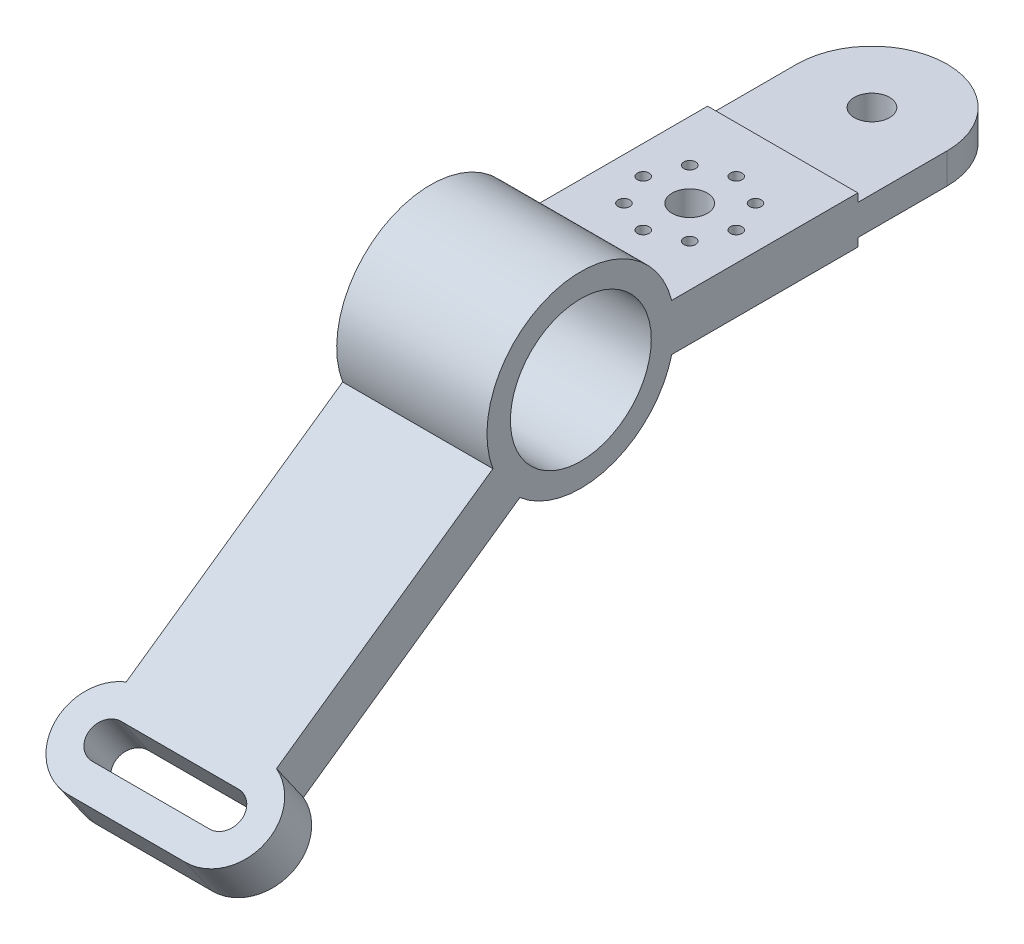
ISO-10303-21;
HEADER;
FILE_DESCRIPTION(('STEP AP214'),'2;1');
FILE_NAME('part.step','',(''),(''),'','','');
FILE_SCHEMA(('AUTOMOTIVE_DESIGN { 1 0 10303 214 1 1 1 1 }'));
ENDSEC;
DATA;
#1=APPLICATION_CONTEXT('core data for automotive mechanical design processes');
#2=APPLICATION_PROTOCOL_DEFINITION('international standard','automotive_design',2000,#1);
#3=PRODUCT_CONTEXT('',#1,'mechanical');
#4=PRODUCT('Part','Part','',(#3));
#5=PRODUCT_RELATED_PRODUCT_CATEGORY('part','',(#4));
#6=PRODUCT_DEFINITION_FORMATION('','',#4);
#7=PRODUCT_DEFINITION_CONTEXT('part definition',#1,'design');
#8=PRODUCT_DEFINITION('design','',#6,#7);
#9=PRODUCT_DEFINITION_SHAPE('','',#8);
#10=(LENGTH_UNIT() NAMED_UNIT(*) SI_UNIT(.MILLI.,.METRE.));
#11=(NAMED_UNIT(*) PLANE_ANGLE_UNIT() SI_UNIT($,.RADIAN.));
#12=(NAMED_UNIT(*) SI_UNIT($,.STERADIAN.) SOLID_ANGLE_UNIT());
#13=UNCERTAINTY_MEASURE_WITH_UNIT(LENGTH_MEASURE(1.E-05),#10,'distance_accuracy_value','');
#14=(GEOMETRIC_REPRESENTATION_CONTEXT(3) GLOBAL_UNCERTAINTY_ASSIGNED_CONTEXT((#13)) GLOBAL_UNIT_ASSIGNED_CONTEXT((#10,
#11,#12)) REPRESENTATION_CONTEXT('',''));
#15=CARTESIAN_POINT('',(0.,0.,0.));
#16=DIRECTION('',(0.,0.,1.));
#17=DIRECTION('',(1.,0.,0.));
#18=AXIS2_PLACEMENT_3D('',#15,#16,#17);
#19=CARTESIAN_POINT('',(32.,89.3164737367872,-144.991611892639));
#20=DIRECTION('',(1.,0.,0.));
#21=DIRECTION('',(0.,0.,-1.));
#22=AXIS2_PLACEMENT_3D('',#19,#20,#21);
#23=PLANE('',#22);
#24=DIRECTION('',(0.,0.819152044288995,0.573576436351042));
#25=VECTOR('',#24,1.);
#26=CARTESIAN_POINT('',(32.,-41.6797797436734,-52.0557005573729));
#27=LINE('',#26,#25);
#28=CARTESIAN_POINT('',(32.,-5.63708979495766,-26.818337357927));
#29=VERTEX_POINT('',#28);
#30=CARTESIAN_POINT('',(32.,10.7459510908222,-15.3468086309062));
#31=VERTEX_POINT('',#30);
#32=EDGE_CURVE('E260',#29,#31,#27,.T.);
#33=ORIENTED_EDGE('',*,*,#32,.F.);
#34=DIRECTION('',(0.,0.573576436351042,-0.819152044288995));
#35=VECTOR('',#34,1.);
#36=CARTESIAN_POINT('',(32.,-16.3830408857799,-11.4715287270208));
#37=LINE('',#36,#35);
#38=CARTESIAN_POINT('',(32.,58.9104334362514,-119.00175400072));
#39=VERTEX_POINT('',#38);
#40=EDGE_CURVE('E110',#29,#39,#37,.T.);
#41=ORIENTED_EDGE('',*,*,#40,.T.);
#42=CARTESIAN_POINT('',(32.,89.3164737367872,-144.991611892639));
#43=DIRECTION('',(1.,0.,0.));
#44=DIRECTION('',(0.,0.,-1.));
#45=AXIS2_PLACEMENT_3D('',#42,#43,#44);
#46=CIRCLE('',#45,40.);
#47=CARTESIAN_POINT('',(32.,79.3164737367872,-183.721445354714));
#48=VERTEX_POINT('',#47);
#49=EDGE_CURVE('E249',#39,#48,#46,.T.);
#50=ORIENTED_EDGE('',*,*,#49,.T.);
#51=DIRECTION('',(0.,0.,-1.));
#52=VECTOR('',#51,1.);
#53=CARTESIAN_POINT('',(32.,79.3164737367872,-262.99161189264));
#54=LINE('',#53,#52);
#55=CARTESIAN_POINT('',(32.,79.3164737367872,-262.99161189264));
#56=VERTEX_POINT('',#55);
#57=EDGE_CURVE('E211',#48,#56,#54,.T.);
#58=ORIENTED_EDGE('',*,*,#57,.T.);
#59=DIRECTION('',(0.,1.,0.));
#60=VECTOR('',#59,1.);
#61=CARTESIAN_POINT('',(32.,82.8164737367872,-262.99161189264));
#62=LINE('',#61,#60);
#63=CARTESIAN_POINT('',(32.,82.8164737367872,-262.99161189264));
#64=VERTEX_POINT('',#63);
#65=EDGE_CURVE('E239',#56,#64,#62,.T.);
#66=ORIENTED_EDGE('',*,*,#65,.T.);
#67=DIRECTION('',(0.,0.,-1.));
#68=VECTOR('',#67,1.);
#69=CARTESIAN_POINT('',(32.,82.8164737367872,-300.99161189264));
#70=LINE('',#69,#68);
#71=CARTESIAN_POINT('',(32.,82.8164737367872,-300.99161189264));
#72=VERTEX_POINT('',#71);
#73=EDGE_CURVE('E232',#64,#72,#70,.T.);
#74=ORIENTED_EDGE('',*,*,#73,.T.);
#75=DIRECTION('',(0.,1.,0.));
#76=VECTOR('',#75,1.);
#77=CARTESIAN_POINT('',(32.,95.8164737367872,-300.99161189264));
#78=LINE('',#77,#76);
#79=CARTESIAN_POINT('',(32.,95.8164737367872,-300.99161189264));
#80=VERTEX_POINT('',#79);
#81=EDGE_CURVE('E238',#72,#80,#78,.T.);
#82=ORIENTED_EDGE('',*,*,#81,.T.);
#83=DIRECTION('',(0.,0.,1.));
#84=VECTOR('',#83,1.);
#85=CARTESIAN_POINT('',(32.,95.8164737367872,-262.99161189264));
#86=LINE('',#85,#84);
#87=CARTESIAN_POINT('',(32.,95.8164737367872,-262.99161189264));
#88=VERTEX_POINT('',#87);
#89=EDGE_CURVE('E133',#80,#88,#86,.T.);
#90=ORIENTED_EDGE('',*,*,#89,.T.);
#91=DIRECTION('',(0.,1.,0.));
#92=VECTOR('',#91,1.);
#93=CARTESIAN_POINT('',(32.,99.3164737367872,-262.99161189264));
#94=LINE('',#93,#92);
#95=CARTESIAN_POINT('',(32.,99.3164737367872,-262.99161189264));
#96=VERTEX_POINT('',#95);
#97=EDGE_CURVE('E126',#88,#96,#94,.T.);
#98=ORIENTED_EDGE('',*,*,#97,.T.);
#99=DIRECTION('',(0.,0.,1.));
#100=VECTOR('',#99,1.);
#101=CARTESIAN_POINT('',(32.,99.3164737367872,-262.99161189264));
#102=LINE('',#101,#100);
#103=CARTESIAN_POINT('',(32.,99.3164737367872,-183.721445354714));
#104=VERTEX_POINT('',#103);
#105=EDGE_CURVE('E130',#96,#104,#102,.T.);
#106=ORIENTED_EDGE('',*,*,#105,.T.);
#107=CARTESIAN_POINT('',(32.,89.3164737367872,-144.991611892639));
#108=DIRECTION('',(1.,0.,0.));
#109=DIRECTION('',(0.,0.,-1.));
#110=AXIS2_PLACEMENT_3D('',#107,#108,#109);
#111=CIRCLE('',#110,40.);
#112=CARTESIAN_POINT('',(32.,75.2934743220313,-107.530225273699));
#113=VERTEX_POINT('',#112);
#114=EDGE_CURVE('E63',#104,#113,#111,.T.);
#115=ORIENTED_EDGE('',*,*,#114,.T.);
#116=DIRECTION('',(0.,-0.573576436351042,0.819152044288995));
#117=VECTOR('',#116,1.);
#118=CARTESIAN_POINT('',(32.,0.,0.));
#119=LINE('',#118,#117);
#120=EDGE_CURVE('E189',#113,#31,#119,.T.);
#121=ORIENTED_EDGE('',*,*,#120,.T.);
#122=EDGE_LOOP('',(#33,#41,#50,#58,#66,#74,#82,#90,#98,#106,#115,#121));
#123=FACE_BOUND('',#122,.T.);
#124=CARTESIAN_POINT('',(32.,89.3164737367872,-144.991611892639));
#125=DIRECTION('',(1.,0.,0.));
#126=DIRECTION('',(0.,0.,-1.));
#127=AXIS2_PLACEMENT_3D('',#124,#125,#126);
#128=CIRCLE('',#127,30.);
#129=CARTESIAN_POINT('',(32.,89.3164737367872,-174.991611892639));
#130=VERTEX_POINT('',#129);
#131=EDGE_CURVE('E160',#130,#130,#128,.T.);
#132=ORIENTED_EDGE('',*,*,#131,.F.);
#133=EDGE_LOOP('',(#132));
#134=FACE_BOUND('',#133,.T.);
#135=ADVANCED_FACE('F45',(#123,#134),#23,.T.);
#136=CARTESIAN_POINT('',(-32.,89.3164737367872,-144.991611892639));
#137=DIRECTION('',(1.,0.,0.));
#138=DIRECTION('',(0.,0.,-1.));
#139=AXIS2_PLACEMENT_3D('',#136,#137,#138);
#140=PLANE('',#139);
#141=DIRECTION('',(0.,0.573576436351042,-0.819152044288995));
#142=VECTOR('',#141,1.);
#143=CARTESIAN_POINT('',(-32.,-16.3830408857799,-11.4715287270208));
#144=LINE('',#143,#142);
#145=CARTESIAN_POINT('',(-32.,-5.63708979495766,-26.818337357927));
#146=VERTEX_POINT('',#145);
#147=CARTESIAN_POINT('',(-32.,58.9104334362514,-119.00175400072));
#148=VERTEX_POINT('',#147);
#149=EDGE_CURVE('E159',#146,#148,#144,.T.);
#150=ORIENTED_EDGE('',*,*,#149,.F.);
#151=DIRECTION('',(0.,0.819152044288995,0.573576436351042));
#152=VECTOR('',#151,1.);
#153=CARTESIAN_POINT('',(-32.,-41.6797797436734,-52.0557005573729));
#154=LINE('',#153,#152);
#155=CARTESIAN_POINT('',(-32.,10.7459510908222,-15.3468086309062));
#156=VERTEX_POINT('',#155);
#157=EDGE_CURVE('E267',#146,#156,#154,.T.);
#158=ORIENTED_EDGE('',*,*,#157,.T.);
#159=DIRECTION('',(0.,-0.573576436351042,0.819152044288995));
#160=VECTOR('',#159,1.);
#161=CARTESIAN_POINT('',(-32.,0.,0.));
#162=LINE('',#161,#160);
#163=CARTESIAN_POINT('',(-32.,75.2934743220313,-107.530225273699));
#164=VERTEX_POINT('',#163);
#165=EDGE_CURVE('E155',#164,#156,#162,.T.);
#166=ORIENTED_EDGE('',*,*,#165,.F.);
#167=CARTESIAN_POINT('',(-32.,89.3164737367872,-144.991611892639));
#168=DIRECTION('',(1.,0.,0.));
#169=DIRECTION('',(0.,0.,-1.));
#170=AXIS2_PLACEMENT_3D('',#167,#168,#169);
#171=CIRCLE('',#170,40.);
#172=CARTESIAN_POINT('',(-32.,99.3164737367872,-183.721445354714));
#173=VERTEX_POINT('',#172);
#174=EDGE_CURVE('E102',#173,#164,#171,.T.);
#175=ORIENTED_EDGE('',*,*,#174,.F.);
#176=DIRECTION('',(0.,0.,1.));
#177=VECTOR('',#176,1.);
#178=CARTESIAN_POINT('',(-32.,99.3164737367872,-262.99161189264));
#179=LINE('',#178,#177);
#180=CARTESIAN_POINT('',(-32.,99.3164737367872,-262.99161189264));
#181=VERTEX_POINT('',#180);
#182=EDGE_CURVE('E96',#181,#173,#179,.T.);
#183=ORIENTED_EDGE('',*,*,#182,.F.);
#184=DIRECTION('',(0.,1.,0.));
#185=VECTOR('',#184,1.);
#186=CARTESIAN_POINT('',(-32.,99.3164737367872,-262.99161189264));
#187=LINE('',#186,#185);
#188=CARTESIAN_POINT('',(-32.,95.8164737367872,-262.99161189264));
#189=VERTEX_POINT('',#188);
#190=EDGE_CURVE('E142',#189,#181,#187,.T.);
#191=ORIENTED_EDGE('',*,*,#190,.F.);
#192=DIRECTION('',(0.,0.,1.));
#193=VECTOR('',#192,1.);
#194=CARTESIAN_POINT('',(-32.,95.8164737367872,-262.99161189264));
#195=LINE('',#194,#193);
#196=CARTESIAN_POINT('',(-32.,95.8164737367872,-300.99161189264));
#197=VERTEX_POINT('',#196);
#198=EDGE_CURVE('E180',#197,#189,#195,.T.);
#199=ORIENTED_EDGE('',*,*,#198,.F.);
#200=DIRECTION('',(0.,1.,0.));
#201=VECTOR('',#200,1.);
#202=CARTESIAN_POINT('',(-32.,95.8164737367872,-300.99161189264));
#203=LINE('',#202,#201);
#204=CARTESIAN_POINT('',(-32.,82.8164737367872,-300.99161189264));
#205=VERTEX_POINT('',#204);
#206=EDGE_CURVE('E176',#205,#197,#203,.T.);
#207=ORIENTED_EDGE('',*,*,#206,.F.);
#208=DIRECTION('',(0.,0.,-1.));
#209=VECTOR('',#208,1.);
#210=CARTESIAN_POINT('',(-32.,82.8164737367872,-300.99161189264));
#211=LINE('',#210,#209);
#212=CARTESIAN_POINT('',(-32.,82.8164737367872,-262.99161189264));
#213=VERTEX_POINT('',#212);
#214=EDGE_CURVE('E172',#213,#205,#211,.T.);
#215=ORIENTED_EDGE('',*,*,#214,.F.);
#216=DIRECTION('',(0.,1.,0.));
#217=VECTOR('',#216,1.);
#218=CARTESIAN_POINT('',(-32.,82.8164737367872,-262.99161189264));
#219=LINE('',#218,#217);
#220=CARTESIAN_POINT('',(-32.,79.3164737367872,-262.99161189264));
#221=VERTEX_POINT('',#220);
#222=EDGE_CURVE('E169',#221,#213,#219,.T.);
#223=ORIENTED_EDGE('',*,*,#222,.F.);
#224=DIRECTION('',(0.,0.,-1.));
#225=VECTOR('',#224,1.);
#226=CARTESIAN_POINT('',(-32.,79.3164737367872,-262.99161189264));
#227=LINE('',#226,#225);
#228=CARTESIAN_POINT('',(-32.,79.3164737367872,-183.721445354714));
#229=VERTEX_POINT('',#228);
#230=EDGE_CURVE('E166',#229,#221,#227,.T.);
#231=ORIENTED_EDGE('',*,*,#230,.F.);
#232=CARTESIAN_POINT('',(-32.,89.3164737367872,-144.991611892639));
#233=DIRECTION('',(1.,0.,0.));
#234=DIRECTION('',(0.,0.,-1.));
#235=AXIS2_PLACEMENT_3D('',#232,#233,#234);
#236=CIRCLE('',#235,40.);
#237=EDGE_CURVE('E163',#148,#229,#236,.T.);
#238=ORIENTED_EDGE('',*,*,#237,.F.);
#239=EDGE_LOOP('',(#150,#158,#166,#175,#183,#191,#199,#207,#215,#223,#231,#238));
#240=FACE_BOUND('',#239,.T.);
#241=CARTESIAN_POINT('',(-32.,89.3164737367872,-144.991611892639));
#242=DIRECTION('',(1.,0.,0.));
#243=DIRECTION('',(0.,0.,-1.));
#244=AXIS2_PLACEMENT_3D('',#241,#242,#243);
#245=CIRCLE('',#244,30.);
#246=CARTESIAN_POINT('',(-32.,89.3164737367872,-174.991611892639));
#247=VERTEX_POINT('',#246);
#248=EDGE_CURVE('E256',#247,#247,#245,.T.);
#249=ORIENTED_EDGE('',*,*,#248,.T.);
#250=EDGE_LOOP('',(#249));
#251=FACE_BOUND('',#250,.T.);
#252=ADVANCED_FACE('F218',(#240,#251),#140,.F.);
#253=CARTESIAN_POINT('',(32.,0.,0.));
#254=DIRECTION('',(0.,-0.819152044288995,-0.573576436351042));
#255=DIRECTION('',(0.,0.573576436351042,-0.819152044288995));
#256=AXIS2_PLACEMENT_3D('',#253,#254,#255);
#257=PLANE('',#256);
#258=ORIENTED_EDGE('',*,*,#165,.T.);
#259=CARTESIAN_POINT('',(-25.,0.,0.));
#260=DIRECTION('',(0.,0.819152044288995,0.573576436351042));
#261=DIRECTION('',(0.,-0.573576436351042,0.819152044288995));
#262=AXIS2_PLACEMENT_3D('',#259,#260,#261);
#263=CIRCLE('',#262,20.);
#264=CARTESIAN_POINT('',(-25.,-11.4715287270208,16.3830408857799));
#265=VERTEX_POINT('',#264);
#266=EDGE_CURVE('E289',#156,#265,#263,.T.);
#267=ORIENTED_EDGE('',*,*,#266,.T.);
#268=DIRECTION('',(1.,0.,0.));
#269=VECTOR('',#268,1.);
#270=CARTESIAN_POINT('',(25.,-11.4715287270208,16.3830408857799));
#271=LINE('',#270,#269);
#272=CARTESIAN_POINT('',(25.,-11.4715287270208,16.3830408857799));
#273=VERTEX_POINT('',#272);
#274=EDGE_CURVE('E282',#265,#273,#271,.T.);
#275=ORIENTED_EDGE('',*,*,#274,.T.);
#276=CARTESIAN_POINT('',(25.,0.,0.));
#277=DIRECTION('',(0.,0.819152044288995,0.573576436351042));
#278=DIRECTION('',(0.,-0.573576436351042,0.819152044288995));
#279=AXIS2_PLACEMENT_3D('',#276,#277,#278);
#280=CIRCLE('',#279,20.);
#281=EDGE_CURVE('E293',#273,#31,#280,.T.);
#282=ORIENTED_EDGE('',*,*,#281,.T.);
#283=ORIENTED_EDGE('',*,*,#120,.F.);
#284=DIRECTION('',(-1.,0.,0.));
#285=VECTOR('',#284,1.);
#286=CARTESIAN_POINT('',(32.,75.2934743220313,-107.530225273699));
#287=LINE('',#286,#285);
#288=EDGE_CURVE('E151',#113,#164,#287,.T.);
#289=ORIENTED_EDGE('',*,*,#288,.T.);
#290=EDGE_LOOP('',(#258,#267,#275,#282,#283,#289));
#291=FACE_BOUND('',#290,.T.);
#292=CARTESIAN_POINT('',(25.,0.,0.));
#293=DIRECTION('',(0.,0.819152044288995,0.573576436351042));
#294=DIRECTION('',(0.,-0.573576436351042,0.819152044288995));
#295=AXIS2_PLACEMENT_3D('',#292,#293,#294);
#296=CIRCLE('',#295,7.5);
#297=CARTESIAN_POINT('',(25.,-4.30182327263282,6.14364033216747));
#298=VERTEX_POINT('',#297);
#299=CARTESIAN_POINT('',(25.,4.30182327263281,-6.14364033216746));
#300=VERTEX_POINT('',#299);
#301=EDGE_CURVE('E325',#298,#300,#296,.T.);
#302=ORIENTED_EDGE('',*,*,#301,.F.);
#303=DIRECTION('',(1.,0.,0.));
#304=VECTOR('',#303,1.);
#305=CARTESIAN_POINT('',(25.,-4.30182327263282,6.14364033216747));
#306=LINE('',#305,#304);
#307=CARTESIAN_POINT('',(-25.,-4.30182327263282,6.14364033216747));
#308=VERTEX_POINT('',#307);
#309=EDGE_CURVE('E303',#308,#298,#306,.T.);
#310=ORIENTED_EDGE('',*,*,#309,.F.);
#311=CARTESIAN_POINT('',(-25.,0.,0.));
#312=DIRECTION('',(0.,0.819152044288995,0.573576436351042));
#313=DIRECTION('',(0.,-0.573576436351042,0.819152044288995));
#314=AXIS2_PLACEMENT_3D('',#311,#312,#313);
#315=CIRCLE('',#314,7.5);
#316=CARTESIAN_POINT('',(-25.,4.30182327263281,-6.14364033216745));
#317=VERTEX_POINT('',#316);
#318=EDGE_CURVE('E317',#317,#308,#315,.T.);
#319=ORIENTED_EDGE('',*,*,#318,.F.);
#320=DIRECTION('',(-1.,0.,0.));
#321=VECTOR('',#320,1.);
#322=CARTESIAN_POINT('',(25.,4.30182327263281,-6.14364033216746));
#323=LINE('',#322,#321);
#324=EDGE_CURVE('E321',#300,#317,#323,.T.);
#325=ORIENTED_EDGE('',*,*,#324,.F.);
#326=EDGE_LOOP('',(#302,#310,#319,#325));
#327=FACE_BOUND('',#326,.T.);
#328=ADVANCED_FACE('F47',(#291,#327),#257,.F.);
#329=CARTESIAN_POINT('',(32.,-16.3830408857799,-11.4715287270208));
#330=DIRECTION('',(0.,0.819152044288995,0.573576436351042));
#331=DIRECTION('',(0.,-0.573576436351042,0.819152044288995));
#332=AXIS2_PLACEMENT_3D('',#329,#330,#331);
#333=PLANE('',#332);
#334=CARTESIAN_POINT('',(-25.,-16.3830408857799,-11.4715287270208));
#335=DIRECTION('',(0.,0.819152044288995,0.573576436351042));
#336=DIRECTION('',(0.,-0.573576436351042,0.819152044288995));
#337=AXIS2_PLACEMENT_3D('',#334,#335,#336);
#338=CIRCLE('',#337,20.);
#339=CARTESIAN_POINT('',(-25.,-27.8545696128007,4.91151215875909));
#340=VERTEX_POINT('',#339);
#341=EDGE_CURVE('E276',#340,#146,#338,.F.);
#342=ORIENTED_EDGE('',*,*,#341,.T.);
#343=ORIENTED_EDGE('',*,*,#149,.T.);
#344=DIRECTION('',(-1.,0.,0.));
#345=VECTOR('',#344,1.);
#346=CARTESIAN_POINT('',(32.,58.9104334362514,-119.00175400072));
#347=LINE('',#346,#345);
#348=EDGE_CURVE('E11',#39,#148,#347,.T.);
#349=ORIENTED_EDGE('',*,*,#348,.F.);
#350=ORIENTED_EDGE('',*,*,#40,.F.);
#351=CARTESIAN_POINT('',(25.,-16.3830408857799,-11.4715287270208));
#352=DIRECTION('',(0.,0.819152044288995,0.573576436351042));
#353=DIRECTION('',(0.,-0.573576436351042,0.819152044288995));
#354=AXIS2_PLACEMENT_3D('',#351,#352,#353);
#355=CIRCLE('',#354,20.);
#356=CARTESIAN_POINT('',(25.,-27.8545696128007,4.91151215875909));
#357=VERTEX_POINT('',#356);
#358=EDGE_CURVE('E330',#29,#357,#355,.F.);
#359=ORIENTED_EDGE('',*,*,#358,.T.);
#360=DIRECTION('',(-1.,0.,0.));
#361=VECTOR('',#360,1.);
#362=CARTESIAN_POINT('',(25.,-27.8545696128007,4.91151215875909));
#363=LINE('',#362,#361);
#364=EDGE_CURVE('E335',#357,#340,#363,.T.);
#365=ORIENTED_EDGE('',*,*,#364,.T.);
#366=EDGE_LOOP('',(#342,#343,#349,#350,#359,#365));
#367=FACE_BOUND('',#366,.T.);
#368=DIRECTION('',(1.,0.,0.));
#369=VECTOR('',#368,1.);
#370=CARTESIAN_POINT('',(25.,-12.0812176131471,-17.6151690591883));
#371=LINE('',#370,#369);
#372=CARTESIAN_POINT('',(-25.,-12.0812176131471,-17.6151690591883));
#373=VERTEX_POINT('',#372);
#374=CARTESIAN_POINT('',(25.,-12.0812176131471,-17.6151690591883));
#375=VERTEX_POINT('',#374);
#376=EDGE_CURVE('E272',#373,#375,#371,.T.);
#377=ORIENTED_EDGE('',*,*,#376,.F.);
#378=CARTESIAN_POINT('',(-25.,-16.3830408857799,-11.4715287270208));
#379=DIRECTION('',(0.,0.819152044288995,0.573576436351042));
#380=DIRECTION('',(0.,-0.573576436351042,0.819152044288995));
#381=AXIS2_PLACEMENT_3D('',#378,#379,#380);
#382=CIRCLE('',#381,7.5);
#383=CARTESIAN_POINT('',(-25.,-20.6848641584127,-5.32788839485335));
#384=VERTEX_POINT('',#383);
#385=EDGE_CURVE('E271',#384,#373,#382,.F.);
#386=ORIENTED_EDGE('',*,*,#385,.F.);
#387=DIRECTION('',(-1.,0.,0.));
#388=VECTOR('',#387,1.);
#389=CARTESIAN_POINT('',(25.,-20.6848641584127,-5.32788839485337));
#390=LINE('',#389,#388);
#391=CARTESIAN_POINT('',(25.,-20.6848641584127,-5.32788839485337));
#392=VERTEX_POINT('',#391);
#393=EDGE_CURVE('E345',#392,#384,#390,.T.);
#394=ORIENTED_EDGE('',*,*,#393,.F.);
#395=CARTESIAN_POINT('',(25.,-16.3830408857799,-11.4715287270208));
#396=DIRECTION('',(0.,0.819152044288995,0.573576436351042));
#397=DIRECTION('',(0.,-0.573576436351042,0.819152044288995));
#398=AXIS2_PLACEMENT_3D('',#395,#396,#397);
#399=CIRCLE('',#398,7.5);
#400=EDGE_CURVE('E334',#375,#392,#399,.F.);
#401=ORIENTED_EDGE('',*,*,#400,.F.);
#402=EDGE_LOOP('',(#377,#386,#394,#401));
#403=FACE_BOUND('',#402,.T.);
#404=ADVANCED_FACE('F535',(#367,#403),#333,.F.);
#405=CARTESIAN_POINT('',(32.,89.3164737367872,-144.991611892639));
#406=DIRECTION('',(-1.,0.,0.));
#407=DIRECTION('',(0.,0.,1.));
#408=AXIS2_PLACEMENT_3D('',#405,#406,#407);
#409=CYLINDRICAL_SURFACE('',#408,40.);
#410=ORIENTED_EDGE('',*,*,#237,.T.);
#411=DIRECTION('',(-1.,0.,0.));
#412=VECTOR('',#411,1.);
#413=CARTESIAN_POINT('',(32.,79.3164737367872,-183.721445354714));
#414=LINE('',#413,#412);
#415=EDGE_CURVE('E55',#48,#229,#414,.T.);
#416=ORIENTED_EDGE('',*,*,#415,.F.);
#417=ORIENTED_EDGE('',*,*,#49,.F.);
#418=ORIENTED_EDGE('',*,*,#348,.T.);
#419=EDGE_LOOP('',(#410,#416,#417,#418));
#420=FACE_BOUND('',#419,.T.);
#421=ADVANCED_FACE('F532',(#420),#409,.T.);
#422=CARTESIAN_POINT('',(32.,79.3164737367872,-262.99161189264));
#423=DIRECTION('',(0.,1.,0.));
#424=DIRECTION('',(0.,0.,1.));
#425=AXIS2_PLACEMENT_3D('',#422,#423,#424);
#426=PLANE('',#425);
#427=CARTESIAN_POINT('',(-14.0078442153538,79.3164737367872,-209.36360113936));
#428=DIRECTION('',(0.,1.,0.));
#429=DIRECTION('',(0.,0.,1.));
#430=AXIS2_PLACEMENT_3D('',#427,#428,#429);
#431=CIRCLE('',#430,2.5);
#432=CARTESIAN_POINT('',(-14.0078442153538,79.3164737367872,-206.86360113936));
#433=VERTEX_POINT('',#432);
#434=EDGE_CURVE('E364',#433,#433,#431,.T.);
#435=ORIENTED_EDGE('',*,*,#434,.T.);
#436=EDGE_LOOP('',(#435));
#437=FACE_BOUND('',#436,.T.);
#438=CARTESIAN_POINT('',(0.,79.3164737367872,-203.561362085751));
#439=DIRECTION('',(0.,1.,0.));
#440=DIRECTION('',(0.,0.,1.));
#441=AXIS2_PLACEMENT_3D('',#438,#439,#440);
#442=CIRCLE('',#441,2.5);
#443=CARTESIAN_POINT('',(0.,79.3164737367872,-201.061362085751));
#444=VERTEX_POINT('',#443);
#445=EDGE_CURVE('E371',#444,#444,#442,.T.);
#446=ORIENTED_EDGE('',*,*,#445,.T.);
#447=EDGE_LOOP('',(#446));
#448=FACE_BOUND('',#447,.T.);
#449=CARTESIAN_POINT('',(-14.0078442153539,79.3164737367872,-237.379289570068));
#450=DIRECTION('',(0.,1.,0.));
#451=DIRECTION('',(0.,0.,1.));
#452=AXIS2_PLACEMENT_3D('',#449,#450,#451);
#453=CIRCLE('',#452,2.5);
#454=CARTESIAN_POINT('',(-14.0078442153539,79.3164737367872,-234.879289570067));
#455=VERTEX_POINT('',#454);
#456=EDGE_CURVE('E375',#455,#455,#453,.T.);
#457=ORIENTED_EDGE('',*,*,#456,.T.);
#458=EDGE_LOOP('',(#457));
#459=FACE_BOUND('',#458,.T.);
#460=CARTESIAN_POINT('',(-19.810083268963,79.3164737367872,-223.371445354714));
#461=DIRECTION('',(0.,1.,0.));
#462=DIRECTION('',(0.,0.,1.));
#463=AXIS2_PLACEMENT_3D('',#460,#461,#462);
#464=CIRCLE('',#463,2.5);
#465=CARTESIAN_POINT('',(-19.810083268963,79.3164737367872,-220.871445354714));
#466=VERTEX_POINT('',#465);
#467=EDGE_CURVE('E379',#466,#466,#464,.T.);
#468=ORIENTED_EDGE('',*,*,#467,.T.);
#469=EDGE_LOOP('',(#468));
#470=FACE_BOUND('',#469,.T.);
#471=CARTESIAN_POINT('',(19.810083268963,79.3164737367872,-223.371445354714));
#472=DIRECTION('',(0.,1.,0.));
#473=DIRECTION('',(0.,0.,1.));
#474=AXIS2_PLACEMENT_3D('',#471,#472,#473);
#475=CIRCLE('',#474,2.5);
#476=CARTESIAN_POINT('',(19.810083268963,79.3164737367872,-220.871445354714));
#477=VERTEX_POINT('',#476);
#478=EDGE_CURVE('E383',#477,#477,#475,.T.);
#479=ORIENTED_EDGE('',*,*,#478,.T.);
#480=EDGE_LOOP('',(#479));
#481=FACE_BOUND('',#480,.T.);
#482=CARTESIAN_POINT('',(14.007844215354,79.3164737367872,-209.36360113936));
#483=DIRECTION('',(0.,1.,0.));
#484=DIRECTION('',(0.,0.,1.));
#485=AXIS2_PLACEMENT_3D('',#482,#483,#484);
#486=CIRCLE('',#485,2.5);
#487=CARTESIAN_POINT('',(14.007844215354,79.3164737367872,-206.86360113936));
#488=VERTEX_POINT('',#487);
#489=EDGE_CURVE('E387',#488,#488,#486,.T.);
#490=ORIENTED_EDGE('',*,*,#489,.T.);
#491=EDGE_LOOP('',(#490));
#492=FACE_BOUND('',#491,.T.);
#493=CARTESIAN_POINT('',(14.0078442153537,79.3164737367872,-237.379289570068));
#494=DIRECTION('',(0.,1.,0.));
#495=DIRECTION('',(0.,0.,1.));
#496=AXIS2_PLACEMENT_3D('',#493,#494,#495);
#497=CIRCLE('',#496,2.5);
#498=CARTESIAN_POINT('',(14.0078442153537,79.3164737367872,-234.879289570068));
#499=VERTEX_POINT('',#498);
#500=EDGE_CURVE('E391',#499,#499,#497,.T.);
#501=ORIENTED_EDGE('',*,*,#500,.T.);
#502=EDGE_LOOP('',(#501));
#503=FACE_BOUND('',#502,.T.);
#504=CARTESIAN_POINT('',(0.,79.3164737367872,-223.371445354714));
#505=DIRECTION('',(0.,1.,0.));
#506=DIRECTION('',(0.,0.,1.));
#507=AXIS2_PLACEMENT_3D('',#504,#505,#506);
#508=CIRCLE('',#507,7.50000000000001);
#509=CARTESIAN_POINT('',(0.,79.3164737367872,-215.871445354714));
#510=VERTEX_POINT('',#509);
#511=EDGE_CURVE('E329',#510,#510,#508,.T.);
#512=ORIENTED_EDGE('',*,*,#511,.T.);
#513=EDGE_LOOP('',(#512));
#514=FACE_BOUND('',#513,.T.);
#515=CARTESIAN_POINT('',(0.,79.3164737367872,-243.181528623677));
#516=DIRECTION('',(0.,1.,0.));
#517=DIRECTION('',(0.,0.,1.));
#518=AXIS2_PLACEMENT_3D('',#515,#516,#517);
#519=CIRCLE('',#518,2.5);
#520=CARTESIAN_POINT('',(0.,79.3164737367872,-240.681528623677));
#521=VERTEX_POINT('',#520);
#522=EDGE_CURVE('E355',#521,#521,#519,.T.);
#523=ORIENTED_EDGE('',*,*,#522,.T.);
#524=EDGE_LOOP('',(#523));
#525=FACE_BOUND('',#524,.T.);
#526=ORIENTED_EDGE('',*,*,#230,.T.);
#527=DIRECTION('',(-1.,0.,0.));
#528=VECTOR('',#527,1.);
#529=CARTESIAN_POINT('',(32.,79.3164737367872,-262.99161189264));
#530=LINE('',#529,#528);
#531=EDGE_CURVE('E200',#56,#221,#530,.T.);
#532=ORIENTED_EDGE('',*,*,#531,.F.);
#533=ORIENTED_EDGE('',*,*,#57,.F.);
#534=ORIENTED_EDGE('',*,*,#415,.T.);
#535=EDGE_LOOP('',(#526,#532,#533,#534));
#536=FACE_BOUND('',#535,.T.);
#537=ADVANCED_FACE('F209',(#437,#448,#459,#470,#481,#492,#503,#514,#525,#536),#426,.F.);
#538=CARTESIAN_POINT('',(32.,82.8164737367872,-262.99161189264));
#539=DIRECTION('',(0.,0.,1.));
#540=DIRECTION('',(1.,0.,0.));
#541=AXIS2_PLACEMENT_3D('',#538,#539,#540);
#542=PLANE('',#541);
#543=ORIENTED_EDGE('',*,*,#222,.T.);
#544=DIRECTION('',(-1.,0.,0.));
#545=VECTOR('',#544,1.);
#546=CARTESIAN_POINT('',(32.,82.8164737367872,-262.99161189264));
#547=LINE('',#546,#545);
#548=EDGE_CURVE('E196',#64,#213,#547,.T.);
#549=ORIENTED_EDGE('',*,*,#548,.F.);
#550=ORIENTED_EDGE('',*,*,#65,.F.);
#551=ORIENTED_EDGE('',*,*,#531,.T.);
#552=EDGE_LOOP('',(#543,#549,#550,#551));
#553=FACE_BOUND('',#552,.T.);
#554=ADVANCED_FACE('F224',(#553),#542,.F.);
#555=CARTESIAN_POINT('',(32.,82.8164737367872,-300.99161189264));
#556=DIRECTION('',(0.,1.,0.));
#557=DIRECTION('',(0.,0.,1.));
#558=AXIS2_PLACEMENT_3D('',#555,#556,#557);
#559=PLANE('',#558);
#560=CARTESIAN_POINT('',(0.,82.8164737367872,-300.991611892639));
#561=DIRECTION('',(0.,1.,0.));
#562=DIRECTION('',(0.,0.,1.));
#563=AXIS2_PLACEMENT_3D('',#560,#561,#562);
#564=CIRCLE('',#563,7.50000000000001);
#565=CARTESIAN_POINT('',(0.,82.8164737367872,-293.491611892639));
#566=VERTEX_POINT('',#565);
#567=EDGE_CURVE('E426',#566,#566,#564,.T.);
#568=ORIENTED_EDGE('',*,*,#567,.T.);
#569=EDGE_LOOP('',(#568));
#570=FACE_BOUND('',#569,.T.);
#571=ORIENTED_EDGE('',*,*,#214,.T.);
#572=CARTESIAN_POINT('',(0.,82.8164737367872,-300.99161189264));
#573=DIRECTION('',(0.,1.,0.));
#574=DIRECTION('',(0.,0.,1.));
#575=AXIS2_PLACEMENT_3D('',#572,#573,#574);
#576=CIRCLE('',#575,32.);
#577=EDGE_CURVE('E235',#205,#72,#576,.F.);
#578=ORIENTED_EDGE('',*,*,#577,.T.);
#579=ORIENTED_EDGE('',*,*,#73,.F.);
#580=ORIENTED_EDGE('',*,*,#548,.T.);
#581=EDGE_LOOP('',(#571,#578,#579,#580));
#582=FACE_BOUND('',#581,.T.);
#583=ADVANCED_FACE('F228',(#570,#582),#559,.F.);
#584=CARTESIAN_POINT('',(32.,95.8164737367872,-262.99161189264));
#585=DIRECTION('',(0.,-1.,0.));
#586=DIRECTION('',(0.,0.,-1.));
#587=AXIS2_PLACEMENT_3D('',#584,#585,#586);
#588=PLANE('',#587);
#589=CARTESIAN_POINT('',(0.,95.8164737367872,-300.991611892639));
#590=DIRECTION('',(0.,1.,0.));
#591=DIRECTION('',(0.,0.,1.));
#592=AXIS2_PLACEMENT_3D('',#589,#590,#591);
#593=CIRCLE('',#592,7.50000000000001);
#594=CARTESIAN_POINT('',(0.,95.8164737367872,-293.491611892639));
#595=VERTEX_POINT('',#594);
#596=EDGE_CURVE('E432',#595,#595,#593,.T.);
#597=ORIENTED_EDGE('',*,*,#596,.F.);
#598=EDGE_LOOP('',(#597));
#599=FACE_BOUND('',#598,.T.);
#600=ORIENTED_EDGE('',*,*,#198,.T.);
#601=DIRECTION('',(-1.,0.,0.));
#602=VECTOR('',#601,1.);
#603=CARTESIAN_POINT('',(32.,95.8164737367872,-262.99161189264));
#604=LINE('',#603,#602);
#605=EDGE_CURVE('E144',#88,#189,#604,.T.);
#606=ORIENTED_EDGE('',*,*,#605,.F.);
#607=ORIENTED_EDGE('',*,*,#89,.F.);
#608=CARTESIAN_POINT('',(0.,95.8164737367872,-300.991611892639));
#609=DIRECTION('',(0.,1.,0.));
#610=DIRECTION('',(0.,0.,-1.));
#611=AXIS2_PLACEMENT_3D('',#608,#609,#610);
#612=CIRCLE('',#611,32.);
#613=EDGE_CURVE('E423',#80,#197,#612,.T.);
#614=ORIENTED_EDGE('',*,*,#613,.T.);
#615=EDGE_LOOP('',(#600,#606,#607,#614));
#616=FACE_BOUND('',#615,.T.);
#617=ADVANCED_FACE('F440',(#599,#616),#588,.F.);
#618=CARTESIAN_POINT('',(32.,99.3164737367872,-262.99161189264));
#619=DIRECTION('',(0.,0.,1.));
#620=DIRECTION('',(1.,0.,0.));
#621=AXIS2_PLACEMENT_3D('',#618,#619,#620);
#622=PLANE('',#621);
#623=ORIENTED_EDGE('',*,*,#190,.T.);
#624=DIRECTION('',(-1.,0.,0.));
#625=VECTOR('',#624,1.);
#626=CARTESIAN_POINT('',(32.,99.3164737367872,-262.99161189264));
#627=LINE('',#626,#625);
#628=EDGE_CURVE('E139',#96,#181,#627,.T.);
#629=ORIENTED_EDGE('',*,*,#628,.F.);
#630=ORIENTED_EDGE('',*,*,#97,.F.);
#631=ORIENTED_EDGE('',*,*,#605,.T.);
#632=EDGE_LOOP('',(#623,#629,#630,#631));
#633=FACE_BOUND('',#632,.T.);
#634=ADVANCED_FACE('F140',(#633),#622,.F.);
#635=CARTESIAN_POINT('',(32.,99.3164737367872,-262.99161189264));
#636=DIRECTION('',(0.,-1.,0.));
#637=DIRECTION('',(0.,0.,-1.));
#638=AXIS2_PLACEMENT_3D('',#635,#636,#637);
#639=PLANE('',#638);
#640=CARTESIAN_POINT('',(-14.0078442153538,99.3164737367872,-209.36360113936));
#641=DIRECTION('',(0.,1.,0.));
#642=DIRECTION('',(0.707106781186544,0.,-0.707106781186551));
#643=AXIS2_PLACEMENT_3D('',#640,#641,#642);
#644=CIRCLE('',#643,2.5);
#645=CARTESIAN_POINT('',(-12.2400772623874,99.3164737367872,-211.131368092326));
#646=VERTEX_POINT('',#645);
#647=EDGE_CURVE('E403',#646,#646,#644,.T.);
#648=ORIENTED_EDGE('',*,*,#647,.F.);
#649=EDGE_LOOP('',(#648));
#650=FACE_BOUND('',#649,.T.);
#651=CARTESIAN_POINT('',(0.,99.3164737367872,-203.561362085751));
#652=DIRECTION('',(0.,1.,0.));
#653=DIRECTION('',(0.,0.,-1.));
#654=AXIS2_PLACEMENT_3D('',#651,#652,#653);
#655=CIRCLE('',#654,2.5);
#656=CARTESIAN_POINT('',(0.,99.3164737367872,-206.061362085751));
#657=VERTEX_POINT('',#656);
#658=EDGE_CURVE('E407',#657,#657,#655,.T.);
#659=ORIENTED_EDGE('',*,*,#658,.F.);
#660=EDGE_LOOP('',(#659));
#661=FACE_BOUND('',#660,.T.);
#662=CARTESIAN_POINT('',(-14.0078442153539,99.3164737367872,-237.379289570068));
#663=DIRECTION('',(0.,1.,0.));
#664=DIRECTION('',(0.707106781186549,0.,0.707106781186546));
#665=AXIS2_PLACEMENT_3D('',#662,#663,#664);
#666=CIRCLE('',#665,2.5);
#667=CARTESIAN_POINT('',(-12.2400772623875,99.3164737367872,-235.611522617101));
#668=VERTEX_POINT('',#667);
#669=EDGE_CURVE('E395',#668,#668,#666,.T.);
#670=ORIENTED_EDGE('',*,*,#669,.F.);
#671=EDGE_LOOP('',(#670));
#672=FACE_BOUND('',#671,.T.);
#673=CARTESIAN_POINT('',(-19.810083268963,99.3164737367872,-223.371445354714));
#674=DIRECTION('',(0.,1.,0.));
#675=DIRECTION('',(1.,0.,0.));
#676=AXIS2_PLACEMENT_3D('',#673,#674,#675);
#677=CIRCLE('',#676,2.5);
#678=CARTESIAN_POINT('',(-17.310083268963,99.3164737367872,-223.371445354714));
#679=VERTEX_POINT('',#678);
#680=EDGE_CURVE('E399',#679,#679,#677,.T.);
#681=ORIENTED_EDGE('',*,*,#680,.F.);
#682=EDGE_LOOP('',(#681));
#683=FACE_BOUND('',#682,.T.);
#684=CARTESIAN_POINT('',(19.810083268963,99.3164737367872,-223.371445354714));
#685=DIRECTION('',(0.,1.,0.));
#686=DIRECTION('',(-1.,0.,0.));
#687=AXIS2_PLACEMENT_3D('',#684,#685,#686);
#688=CIRCLE('',#687,2.5);
#689=CARTESIAN_POINT('',(17.310083268963,99.3164737367872,-223.371445354714));
#690=VERTEX_POINT('',#689);
#691=EDGE_CURVE('E416',#690,#690,#688,.T.);
#692=ORIENTED_EDGE('',*,*,#691,.F.);
#693=EDGE_LOOP('',(#692));
#694=FACE_BOUND('',#693,.T.);
#695=CARTESIAN_POINT('',(14.007844215354,99.3164737367872,-209.36360113936));
#696=DIRECTION('',(0.,1.,0.));
#697=DIRECTION('',(-0.707106781186554,0.,-0.707106781186541));
#698=AXIS2_PLACEMENT_3D('',#695,#696,#697);
#699=CIRCLE('',#698,2.5);
#700=CARTESIAN_POINT('',(12.2400772623876,99.3164737367872,-211.131368092326));
#701=VERTEX_POINT('',#700);
#702=EDGE_CURVE('E411',#701,#701,#699,.T.);
#703=ORIENTED_EDGE('',*,*,#702,.F.);
#704=EDGE_LOOP('',(#703));
#705=FACE_BOUND('',#704,.T.);
#706=CARTESIAN_POINT('',(14.0078442153537,99.3164737367872,-237.379289570068));
#707=DIRECTION('',(0.,1.,0.));
#708=DIRECTION('',(-0.707106781186539,0.,0.707106781186556));
#709=AXIS2_PLACEMENT_3D('',#706,#707,#708);
#710=CIRCLE('',#709,2.5);
#711=CARTESIAN_POINT('',(12.2400772623874,99.3164737367872,-235.611522617101));
#712=VERTEX_POINT('',#711);
#713=EDGE_CURVE('E412',#712,#712,#710,.T.);
#714=ORIENTED_EDGE('',*,*,#713,.F.);
#715=EDGE_LOOP('',(#714));
#716=FACE_BOUND('',#715,.T.);
#717=CARTESIAN_POINT('',(0.,99.3164737367872,-223.371445354714));
#718=DIRECTION('',(0.,1.,0.));
#719=DIRECTION('',(0.,0.,1.));
#720=AXIS2_PLACEMENT_3D('',#717,#718,#719);
#721=CIRCLE('',#720,7.50000000000001);
#722=CARTESIAN_POINT('',(0.,99.3164737367872,-215.871445354714));
#723=VERTEX_POINT('',#722);
#724=EDGE_CURVE('E359',#723,#723,#721,.T.);
#725=ORIENTED_EDGE('',*,*,#724,.F.);
#726=EDGE_LOOP('',(#725));
#727=FACE_BOUND('',#726,.T.);
#728=CARTESIAN_POINT('',(0.,99.3164737367872,-243.181528623677));
#729=DIRECTION('',(0.,1.,0.));
#730=DIRECTION('',(0.,0.,1.));
#731=AXIS2_PLACEMENT_3D('',#728,#729,#730);
#732=CIRCLE('',#731,2.5);
#733=CARTESIAN_POINT('',(0.,99.3164737367872,-240.681528623677));
#734=VERTEX_POINT('',#733);
#735=EDGE_CURVE('E360',#734,#734,#732,.T.);
#736=ORIENTED_EDGE('',*,*,#735,.F.);
#737=EDGE_LOOP('',(#736));
#738=FACE_BOUND('',#737,.T.);
#739=ORIENTED_EDGE('',*,*,#182,.T.);
#740=DIRECTION('',(-1.,0.,0.));
#741=VECTOR('',#740,1.);
#742=CARTESIAN_POINT('',(32.,99.3164737367872,-183.721445354714));
#743=LINE('',#742,#741);
#744=EDGE_CURVE('E145',#104,#173,#743,.T.);
#745=ORIENTED_EDGE('',*,*,#744,.F.);
#746=ORIENTED_EDGE('',*,*,#105,.F.);
#747=ORIENTED_EDGE('',*,*,#628,.T.);
#748=EDGE_LOOP('',(#739,#745,#746,#747));
#749=FACE_BOUND('',#748,.T.);
#750=ADVANCED_FACE('F147',(#650,#661,#672,#683,#694,#705,#716,#727,#738,#749),#639,.F.);
#751=CARTESIAN_POINT('',(32.,89.3164737367872,-144.991611892639));
#752=DIRECTION('',(-1.,0.,0.));
#753=DIRECTION('',(0.,0.,1.));
#754=AXIS2_PLACEMENT_3D('',#751,#752,#753);
#755=CYLINDRICAL_SURFACE('',#754,40.);
#756=ORIENTED_EDGE('',*,*,#174,.T.);
#757=ORIENTED_EDGE('',*,*,#288,.F.);
#758=ORIENTED_EDGE('',*,*,#114,.F.);
#759=ORIENTED_EDGE('',*,*,#744,.T.);
#760=EDGE_LOOP('',(#756,#757,#758,#759));
#761=FACE_BOUND('',#760,.T.);
#762=ADVANCED_FACE('F518',(#761),#755,.T.);
#763=CARTESIAN_POINT('',(32.,89.3164737367872,-144.991611892639));
#764=DIRECTION('',(-1.,0.,0.));
#765=DIRECTION('',(0.,0.,1.));
#766=AXIS2_PLACEMENT_3D('',#763,#764,#765);
#767=CYLINDRICAL_SURFACE('',#766,30.);
#768=ORIENTED_EDGE('',*,*,#131,.T.);
#769=EDGE_LOOP('',(#768));
#770=FACE_BOUND('',#769,.T.);
#771=ORIENTED_EDGE('',*,*,#248,.F.);
#772=EDGE_LOOP('',(#771));
#773=FACE_BOUND('',#772,.T.);
#774=ADVANCED_FACE('F515',(#770,#773),#767,.F.);
#775=CARTESIAN_POINT('',(-25.,-97.0601609083089,-67.9622563278445));
#776=DIRECTION('',(0.,0.819152044288995,0.573576436351042));
#777=DIRECTION('',(0.,-0.573576436351042,0.819152044288995));
#778=AXIS2_PLACEMENT_3D('',#775,#776,#777);
#779=CYLINDRICAL_SURFACE('',#778,20.);
#780=ORIENTED_EDGE('',*,*,#157,.F.);
#781=ORIENTED_EDGE('',*,*,#341,.F.);
#782=DIRECTION('',(0.,0.819152044288995,0.573576436351042));
#783=VECTOR('',#782,1.);
#784=CARTESIAN_POINT('',(-25.,-108.53168963533,-51.5792154420646));
#785=LINE('',#784,#783);
#786=EDGE_CURVE('E278',#340,#265,#785,.T.);
#787=ORIENTED_EDGE('',*,*,#786,.T.);
#788=ORIENTED_EDGE('',*,*,#266,.F.);
#789=EDGE_LOOP('',(#780,#781,#787,#788));
#790=FACE_BOUND('',#789,.T.);
#791=ADVANCED_FACE('F578',(#790),#779,.T.);
#792=CARTESIAN_POINT('',(25.,-108.53168963533,-51.5792154420646));
#793=DIRECTION('',(0.,-0.573576436351042,0.819152044288995));
#794=DIRECTION('',(0.,-0.819152044288995,-0.573576436351042));
#795=AXIS2_PLACEMENT_3D('',#792,#793,#794);
#796=PLANE('',#795);
#797=ORIENTED_EDGE('',*,*,#364,.F.);
#798=DIRECTION('',(0.,0.819152044288995,0.573576436351042));
#799=VECTOR('',#798,1.);
#800=CARTESIAN_POINT('',(25.,-108.53168963533,-51.5792154420646));
#801=LINE('',#800,#799);
#802=EDGE_CURVE('E277',#357,#273,#801,.T.);
#803=ORIENTED_EDGE('',*,*,#802,.T.);
#804=ORIENTED_EDGE('',*,*,#274,.F.);
#805=ORIENTED_EDGE('',*,*,#786,.F.);
#806=EDGE_LOOP('',(#797,#803,#804,#805));
#807=FACE_BOUND('',#806,.T.);
#808=ADVANCED_FACE('F574',(#807),#796,.T.);
#809=CARTESIAN_POINT('',(25.,-97.0601609083089,-67.9622563278445));
#810=DIRECTION('',(0.,0.819152044288995,0.573576436351042));
#811=DIRECTION('',(0.,-0.573576436351042,0.819152044288995));
#812=AXIS2_PLACEMENT_3D('',#809,#810,#811);
#813=CYLINDRICAL_SURFACE('',#812,20.);
#814=ORIENTED_EDGE('',*,*,#358,.F.);
#815=ORIENTED_EDGE('',*,*,#32,.T.);
#816=ORIENTED_EDGE('',*,*,#281,.F.);
#817=ORIENTED_EDGE('',*,*,#802,.F.);
#818=EDGE_LOOP('',(#814,#815,#816,#817));
#819=FACE_BOUND('',#818,.T.);
#820=ADVANCED_FACE('F577',(#819),#813,.T.);
#821=CARTESIAN_POINT('',(25.,-92.7583376356761,-74.105896660012));
#822=DIRECTION('',(0.,0.573576436351042,-0.819152044288995));
#823=DIRECTION('',(0.,0.819152044288995,0.573576436351042));
#824=AXIS2_PLACEMENT_3D('',#821,#822,#823);
#825=PLANE('',#824);
#826=DIRECTION('',(0.,0.819152044288995,0.573576436351042));
#827=VECTOR('',#826,1.);
#828=CARTESIAN_POINT('',(-25.,-92.7583376356761,-74.105896660012));
#829=LINE('',#828,#827);
#830=EDGE_CURVE('E302',#373,#317,#829,.T.);
#831=ORIENTED_EDGE('',*,*,#830,.F.);
#832=ORIENTED_EDGE('',*,*,#376,.T.);
#833=DIRECTION('',(0.,0.819152044288995,0.573576436351042));
#834=VECTOR('',#833,1.);
#835=CARTESIAN_POINT('',(25.,-92.7583376356761,-74.105896660012));
#836=LINE('',#835,#834);
#837=EDGE_CURVE('E298',#375,#300,#836,.T.);
#838=ORIENTED_EDGE('',*,*,#837,.T.);
#839=ORIENTED_EDGE('',*,*,#324,.T.);
#840=EDGE_LOOP('',(#831,#832,#838,#839));
#841=FACE_BOUND('',#840,.T.);
#842=ADVANCED_FACE('F550',(#841),#825,.F.);
#843=CARTESIAN_POINT('',(-25.,-97.0601609083089,-67.9622563278445));
#844=DIRECTION('',(0.,0.819152044288995,0.573576436351042));
#845=DIRECTION('',(0.,-0.573576436351042,0.819152044288995));
#846=AXIS2_PLACEMENT_3D('',#843,#844,#845);
#847=CYLINDRICAL_SURFACE('',#846,7.5);
#848=DIRECTION('',(0.,0.819152044288995,0.573576436351042));
#849=VECTOR('',#848,1.);
#850=CARTESIAN_POINT('',(-25.,-101.361984180942,-61.8186159956771));
#851=LINE('',#850,#849);
#852=EDGE_CURVE('E307',#384,#308,#851,.T.);
#853=ORIENTED_EDGE('',*,*,#852,.F.);
#854=ORIENTED_EDGE('',*,*,#385,.T.);
#855=ORIENTED_EDGE('',*,*,#830,.T.);
#856=ORIENTED_EDGE('',*,*,#318,.T.);
#857=EDGE_LOOP('',(#853,#854,#855,#856));
#858=FACE_BOUND('',#857,.T.);
#859=ADVANCED_FACE('F549',(#858),#847,.F.);
#860=CARTESIAN_POINT('',(25.,-101.361984180942,-61.8186159956771));
#861=DIRECTION('',(0.,-0.573576436351042,0.819152044288995));
#862=DIRECTION('',(0.,-0.819152044288995,-0.573576436351042));
#863=AXIS2_PLACEMENT_3D('',#860,#861,#862);
#864=PLANE('',#863);
#865=DIRECTION('',(0.,0.819152044288995,0.573576436351042));
#866=VECTOR('',#865,1.);
#867=CARTESIAN_POINT('',(25.,-101.361984180942,-61.8186159956771));
#868=LINE('',#867,#866);
#869=EDGE_CURVE('E297',#392,#298,#868,.T.);
#870=ORIENTED_EDGE('',*,*,#869,.F.);
#871=ORIENTED_EDGE('',*,*,#393,.T.);
#872=ORIENTED_EDGE('',*,*,#852,.T.);
#873=ORIENTED_EDGE('',*,*,#309,.T.);
#874=EDGE_LOOP('',(#870,#871,#872,#873));
#875=FACE_BOUND('',#874,.T.);
#876=ADVANCED_FACE('F557',(#875),#864,.F.);
#877=CARTESIAN_POINT('',(25.,-97.0601609083089,-67.9622563278445));
#878=DIRECTION('',(0.,0.819152044288995,0.573576436351042));
#879=DIRECTION('',(0.,-0.573576436351042,0.819152044288995));
#880=AXIS2_PLACEMENT_3D('',#877,#878,#879);
#881=CYLINDRICAL_SURFACE('',#880,7.5);
#882=ORIENTED_EDGE('',*,*,#837,.F.);
#883=ORIENTED_EDGE('',*,*,#400,.T.);
#884=ORIENTED_EDGE('',*,*,#869,.T.);
#885=ORIENTED_EDGE('',*,*,#301,.T.);
#886=EDGE_LOOP('',(#882,#883,#884,#885));
#887=FACE_BOUND('',#886,.T.);
#888=ADVANCED_FACE('F559',(#887),#881,.F.);
#889=CARTESIAN_POINT('',(0.,35.3164737367872,-243.181528623677));
#890=DIRECTION('',(0.,1.,0.));
#891=DIRECTION('',(0.,0.,1.));
#892=AXIS2_PLACEMENT_3D('',#889,#890,#891);
#893=CYLINDRICAL_SURFACE('',#892,2.5);
#894=ORIENTED_EDGE('',*,*,#735,.T.);
#895=EDGE_LOOP('',(#894));
#896=FACE_BOUND('',#895,.T.);
#897=ORIENTED_EDGE('',*,*,#522,.F.);
#898=EDGE_LOOP('',(#897));
#899=FACE_BOUND('',#898,.T.);
#900=ADVANCED_FACE('F561',(#896,#899),#893,.F.);
#901=CARTESIAN_POINT('',(0.,35.3164737367872,-223.371445354714));
#902=DIRECTION('',(0.,1.,0.));
#903=DIRECTION('',(0.,0.,1.));
#904=AXIS2_PLACEMENT_3D('',#901,#902,#903);
#905=CYLINDRICAL_SURFACE('',#904,7.50000000000001);
#906=ORIENTED_EDGE('',*,*,#724,.T.);
#907=EDGE_LOOP('',(#906));
#908=FACE_BOUND('',#907,.T.);
#909=ORIENTED_EDGE('',*,*,#511,.F.);
#910=EDGE_LOOP('',(#909));
#911=FACE_BOUND('',#910,.T.);
#912=ADVANCED_FACE('F567',(#908,#911),#905,.F.);
#913=CARTESIAN_POINT('',(14.0078442153537,35.3164737367872,-237.379289570068));
#914=DIRECTION('',(0.,1.,0.));
#915=DIRECTION('',(0.,0.,1.));
#916=AXIS2_PLACEMENT_3D('',#913,#914,#915);
#917=CYLINDRICAL_SURFACE('',#916,2.5);
#918=ORIENTED_EDGE('',*,*,#713,.T.);
#919=EDGE_LOOP('',(#918));
#920=FACE_BOUND('',#919,.T.);
#921=ORIENTED_EDGE('',*,*,#500,.F.);
#922=EDGE_LOOP('',(#921));
#923=FACE_BOUND('',#922,.T.);
#924=ADVANCED_FACE('F596',(#920,#923),#917,.F.);
#925=CARTESIAN_POINT('',(14.007844215354,35.3164737367872,-209.36360113936));
#926=DIRECTION('',(0.,1.,0.));
#927=DIRECTION('',(0.,0.,1.));
#928=AXIS2_PLACEMENT_3D('',#925,#926,#927);
#929=CYLINDRICAL_SURFACE('',#928,2.5);
#930=ORIENTED_EDGE('',*,*,#702,.T.);
#931=EDGE_LOOP('',(#930));
#932=FACE_BOUND('',#931,.T.);
#933=ORIENTED_EDGE('',*,*,#489,.F.);
#934=EDGE_LOOP('',(#933));
#935=FACE_BOUND('',#934,.T.);
#936=ADVANCED_FACE('F612',(#932,#935),#929,.F.);
#937=CARTESIAN_POINT('',(19.810083268963,35.3164737367872,-223.371445354714));
#938=DIRECTION('',(0.,1.,0.));
#939=DIRECTION('',(0.,0.,1.));
#940=AXIS2_PLACEMENT_3D('',#937,#938,#939);
#941=CYLINDRICAL_SURFACE('',#940,2.5);
#942=ORIENTED_EDGE('',*,*,#691,.T.);
#943=EDGE_LOOP('',(#942));
#944=FACE_BOUND('',#943,.T.);
#945=ORIENTED_EDGE('',*,*,#478,.F.);
#946=EDGE_LOOP('',(#945));
#947=FACE_BOUND('',#946,.T.);
#948=ADVANCED_FACE('F604',(#944,#947),#941,.F.);
#949=CARTESIAN_POINT('',(-19.810083268963,35.3164737367872,-223.371445354714));
#950=DIRECTION('',(0.,1.,0.));
#951=DIRECTION('',(0.,0.,1.));
#952=AXIS2_PLACEMENT_3D('',#949,#950,#951);
#953=CYLINDRICAL_SURFACE('',#952,2.5);
#954=ORIENTED_EDGE('',*,*,#680,.T.);
#955=EDGE_LOOP('',(#954));
#956=FACE_BOUND('',#955,.T.);
#957=ORIENTED_EDGE('',*,*,#467,.F.);
#958=EDGE_LOOP('',(#957));
#959=FACE_BOUND('',#958,.T.);
#960=ADVANCED_FACE('F601',(#956,#959),#953,.F.);
#961=CARTESIAN_POINT('',(-14.0078442153539,35.3164737367872,-237.379289570068));
#962=DIRECTION('',(0.,1.,0.));
#963=DIRECTION('',(0.,0.,1.));
#964=AXIS2_PLACEMENT_3D('',#961,#962,#963);
#965=CYLINDRICAL_SURFACE('',#964,2.5);
#966=ORIENTED_EDGE('',*,*,#669,.T.);
#967=EDGE_LOOP('',(#966));
#968=FACE_BOUND('',#967,.T.);
#969=ORIENTED_EDGE('',*,*,#456,.F.);
#970=EDGE_LOOP('',(#969));
#971=FACE_BOUND('',#970,.T.);
#972=ADVANCED_FACE('F598',(#968,#971),#965,.F.);
#973=CARTESIAN_POINT('',(0.,35.3164737367872,-203.561362085751));
#974=DIRECTION('',(0.,1.,0.));
#975=DIRECTION('',(0.,0.,1.));
#976=AXIS2_PLACEMENT_3D('',#973,#974,#975);
#977=CYLINDRICAL_SURFACE('',#976,2.5);
#978=ORIENTED_EDGE('',*,*,#658,.T.);
#979=EDGE_LOOP('',(#978));
#980=FACE_BOUND('',#979,.T.);
#981=ORIENTED_EDGE('',*,*,#445,.F.);
#982=EDGE_LOOP('',(#981));
#983=FACE_BOUND('',#982,.T.);
#984=ADVANCED_FACE('F505',(#980,#983),#977,.F.);
#985=CARTESIAN_POINT('',(-14.0078442153538,35.3164737367872,-209.36360113936));
#986=DIRECTION('',(0.,1.,0.));
#987=DIRECTION('',(0.,0.,1.));
#988=AXIS2_PLACEMENT_3D('',#985,#986,#987);
#989=CYLINDRICAL_SURFACE('',#988,2.5);
#990=ORIENTED_EDGE('',*,*,#647,.T.);
#991=EDGE_LOOP('',(#990));
#992=FACE_BOUND('',#991,.T.);
#993=ORIENTED_EDGE('',*,*,#434,.F.);
#994=EDGE_LOOP('',(#993));
#995=FACE_BOUND('',#994,.T.);
#996=ADVANCED_FACE('F496',(#992,#995),#989,.F.);
#997=CARTESIAN_POINT('',(0.,11.2622984567939,-300.99161189264));
#998=DIRECTION('',(0.,1.,0.));
#999=DIRECTION('',(0.,0.,1.));
#1000=AXIS2_PLACEMENT_3D('',#997,#998,#999);
#1001=CYLINDRICAL_SURFACE('',#1000,32.);
#1002=ORIENTED_EDGE('',*,*,#577,.F.);
#1003=ORIENTED_EDGE('',*,*,#206,.T.);
#1004=ORIENTED_EDGE('',*,*,#613,.F.);
#1005=ORIENTED_EDGE('',*,*,#81,.F.);
#1006=EDGE_LOOP('',(#1002,#1003,#1004,#1005));
#1007=FACE_BOUND('',#1006,.T.);
#1008=ADVANCED_FACE('F494',(#1007),#1001,.T.);
#1009=CARTESIAN_POINT('',(0.,31.8164737367872,-300.991611892639));
#1010=DIRECTION('',(0.,1.,0.));
#1011=DIRECTION('',(0.,0.,1.));
#1012=AXIS2_PLACEMENT_3D('',#1009,#1010,#1011);
#1013=CYLINDRICAL_SURFACE('',#1012,7.50000000000001);
#1014=ORIENTED_EDGE('',*,*,#596,.T.);
#1015=EDGE_LOOP('',(#1014));
#1016=FACE_BOUND('',#1015,.T.);
#1017=ORIENTED_EDGE('',*,*,#567,.F.);
#1018=EDGE_LOOP('',(#1017));
#1019=FACE_BOUND('',#1018,.T.);
#1020=ADVANCED_FACE('F437',(#1016,#1019),#1013,.F.);
#1021=CLOSED_SHELL('',(#135,#252,#328,#404,#421,#537,#554,#583,#617,#634,#750,#762,#774,#791,
#808,#820,#842,#859,#876,#888,#900,#912,#924,#936,#948,#960,#972,#984,#996,#1008,#1020));
#1022=MANIFOLD_SOLID_BREP('B2',#1021);
#1023=ADVANCED_BREP_SHAPE_REPRESENTATION('',(#18,#1022),#14);
#1024=SHAPE_DEFINITION_REPRESENTATION(#9,#1023);
ENDSEC;
END-ISO-10303-21;
